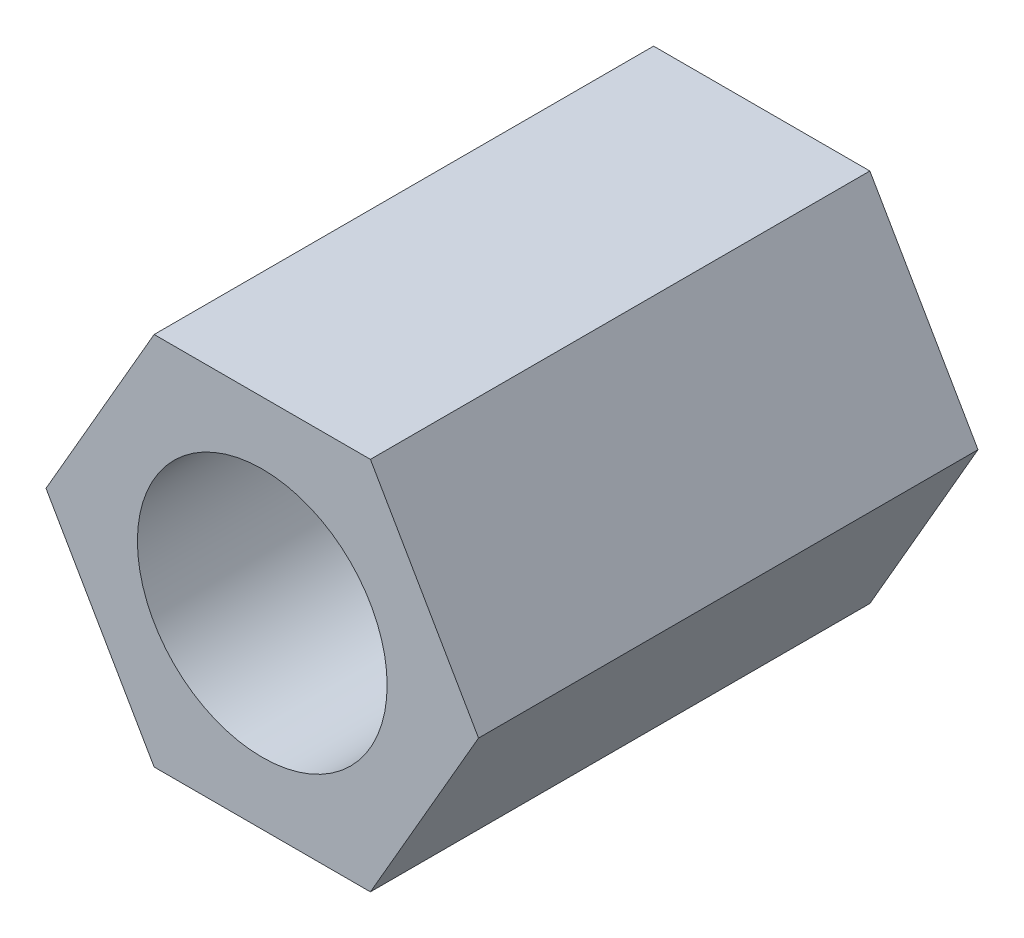
ISO-10303-21;
HEADER;
FILE_DESCRIPTION(('STEP AP214'),'2;1');
FILE_NAME('part.step','',(''),(''),'','','');
FILE_SCHEMA(('AUTOMOTIVE_DESIGN { 1 0 10303 214 1 1 1 1 }'));
ENDSEC;
DATA;
#1=APPLICATION_CONTEXT('core data for automotive mechanical design processes');
#2=APPLICATION_PROTOCOL_DEFINITION('international standard','automotive_design',2000,#1);
#3=PRODUCT_CONTEXT('',#1,'mechanical');
#4=PRODUCT('Part','Part','',(#3));
#5=PRODUCT_RELATED_PRODUCT_CATEGORY('part','',(#4));
#6=PRODUCT_DEFINITION_FORMATION('','',#4);
#7=PRODUCT_DEFINITION_CONTEXT('part definition',#1,'design');
#8=PRODUCT_DEFINITION('design','',#6,#7);
#9=PRODUCT_DEFINITION_SHAPE('','',#8);
#10=(LENGTH_UNIT() NAMED_UNIT(*) SI_UNIT(.MILLI.,.METRE.));
#11=(NAMED_UNIT(*) PLANE_ANGLE_UNIT() SI_UNIT($,.RADIAN.));
#12=(NAMED_UNIT(*) SI_UNIT($,.STERADIAN.) SOLID_ANGLE_UNIT());
#13=UNCERTAINTY_MEASURE_WITH_UNIT(LENGTH_MEASURE(1.E-05),#10,'distance_accuracy_value','');
#14=(GEOMETRIC_REPRESENTATION_CONTEXT(3) GLOBAL_UNCERTAINTY_ASSIGNED_CONTEXT((#13)) GLOBAL_UNIT_ASSIGNED_CONTEXT((#10,
#11,#12)) REPRESENTATION_CONTEXT('',''));
#15=CARTESIAN_POINT('',(0.,0.,0.));
#16=DIRECTION('',(0.,0.,1.));
#17=DIRECTION('',(1.,0.,0.));
#18=AXIS2_PLACEMENT_3D('',#15,#16,#17);
#19=CARTESIAN_POINT('',(0.,0.,4.));
#20=DIRECTION('',(0.,0.,1.));
#21=DIRECTION('',(1.,0.,0.));
#22=AXIS2_PLACEMENT_3D('',#19,#20,#21);
#23=PLANE('',#22);
#24=DIRECTION('',(0.5,0.866025403784438,0.));
#25=VECTOR('',#24,1.);
#26=CARTESIAN_POINT('',(0.86602540378444,-1.5,4.));
#27=LINE('',#26,#25);
#28=CARTESIAN_POINT('',(0.86602540378444,-1.5,4.));
#29=VERTEX_POINT('',#28);
#30=CARTESIAN_POINT('',(1.73205080756888,0.,4.));
#31=VERTEX_POINT('',#30);
#32=EDGE_CURVE('E145',#29,#31,#27,.T.);
#33=ORIENTED_EDGE('',*,*,#32,.T.);
#34=DIRECTION('',(-0.5,0.866025403784438,0.));
#35=VECTOR('',#34,1.);
#36=CARTESIAN_POINT('',(1.73205080756888,0.,4.));
#37=LINE('',#36,#35);
#38=CARTESIAN_POINT('',(0.866025403784438,1.5,4.));
#39=VERTEX_POINT('',#38);
#40=EDGE_CURVE('E93',#31,#39,#37,.T.);
#41=ORIENTED_EDGE('',*,*,#40,.T.);
#42=DIRECTION('',(-1.,0.,0.));
#43=VECTOR('',#42,1.);
#44=CARTESIAN_POINT('',(0.866025403784438,1.5,4.));
#45=LINE('',#44,#43);
#46=CARTESIAN_POINT('',(-0.866025403784439,1.5,4.));
#47=VERTEX_POINT('',#46);
#48=EDGE_CURVE('E106',#39,#47,#45,.T.);
#49=ORIENTED_EDGE('',*,*,#48,.T.);
#50=DIRECTION('',(-0.5,-0.866025403784438,0.));
#51=VECTOR('',#50,1.);
#52=CARTESIAN_POINT('',(-0.866025403784439,1.5,4.));
#53=LINE('',#52,#51);
#54=CARTESIAN_POINT('',(-1.73205080756888,0.,4.));
#55=VERTEX_POINT('',#54);
#56=EDGE_CURVE('E100',#47,#55,#53,.T.);
#57=ORIENTED_EDGE('',*,*,#56,.T.);
#58=DIRECTION('',(0.5,-0.866025403784438,0.));
#59=VECTOR('',#58,1.);
#60=CARTESIAN_POINT('',(-1.73205080756888,0.,4.));
#61=LINE('',#60,#59);
#62=CARTESIAN_POINT('',(-0.866025403784439,-1.5,4.));
#63=VERTEX_POINT('',#62);
#64=EDGE_CURVE('E104',#55,#63,#61,.T.);
#65=ORIENTED_EDGE('',*,*,#64,.T.);
#66=DIRECTION('',(1.,0.,0.));
#67=VECTOR('',#66,1.);
#68=CARTESIAN_POINT('',(-0.866025403784439,-1.5,4.));
#69=LINE('',#68,#67);
#70=EDGE_CURVE('E56',#63,#29,#69,.T.);
#71=ORIENTED_EDGE('',*,*,#70,.T.);
#72=EDGE_LOOP('',(#33,#41,#49,#57,#65,#71));
#73=FACE_BOUND('',#72,.T.);
#74=CARTESIAN_POINT('',(0.,0.,4.));
#75=DIRECTION('',(0.,0.,1.));
#76=DIRECTION('',(1.,0.,0.));
#77=AXIS2_PLACEMENT_3D('',#74,#75,#76);
#78=CIRCLE('',#77,1.);
#79=CARTESIAN_POINT('',(1.,0.,4.));
#80=VERTEX_POINT('',#79);
#81=EDGE_CURVE('E133',#80,#80,#78,.T.);
#82=ORIENTED_EDGE('',*,*,#81,.F.);
#83=EDGE_LOOP('',(#82));
#84=FACE_BOUND('',#83,.T.);
#85=ADVANCED_FACE('F38',(#73,#84),#23,.T.);
#86=CARTESIAN_POINT('',(0.,0.,0.));
#87=DIRECTION('',(0.,0.,1.));
#88=DIRECTION('',(1.,0.,0.));
#89=AXIS2_PLACEMENT_3D('',#86,#87,#88);
#90=PLANE('',#89);
#91=DIRECTION('',(0.5,0.866025403784438,0.));
#92=VECTOR('',#91,1.);
#93=CARTESIAN_POINT('',(0.86602540378444,-1.5,0.));
#94=LINE('',#93,#92);
#95=CARTESIAN_POINT('',(0.86602540378444,-1.5,0.));
#96=VERTEX_POINT('',#95);
#97=CARTESIAN_POINT('',(1.73205080756888,0.,0.));
#98=VERTEX_POINT('',#97);
#99=EDGE_CURVE('E128',#96,#98,#94,.T.);
#100=ORIENTED_EDGE('',*,*,#99,.F.);
#101=DIRECTION('',(1.,0.,0.));
#102=VECTOR('',#101,1.);
#103=CARTESIAN_POINT('',(-0.866025403784439,-1.5,0.));
#104=LINE('',#103,#102);
#105=CARTESIAN_POINT('',(-0.866025403784439,-1.5,0.));
#106=VERTEX_POINT('',#105);
#107=EDGE_CURVE('E85',#106,#96,#104,.T.);
#108=ORIENTED_EDGE('',*,*,#107,.F.);
#109=DIRECTION('',(0.5,-0.866025403784438,0.));
#110=VECTOR('',#109,1.);
#111=CARTESIAN_POINT('',(-1.73205080756888,0.,0.));
#112=LINE('',#111,#110);
#113=CARTESIAN_POINT('',(-1.73205080756888,0.,0.));
#114=VERTEX_POINT('',#113);
#115=EDGE_CURVE('E79',#114,#106,#112,.T.);
#116=ORIENTED_EDGE('',*,*,#115,.F.);
#117=DIRECTION('',(-0.5,-0.866025403784438,0.));
#118=VECTOR('',#117,1.);
#119=CARTESIAN_POINT('',(-0.866025403784439,1.5,0.));
#120=LINE('',#119,#118);
#121=CARTESIAN_POINT('',(-0.866025403784439,1.5,0.));
#122=VERTEX_POINT('',#121);
#123=EDGE_CURVE('E115',#122,#114,#120,.T.);
#124=ORIENTED_EDGE('',*,*,#123,.F.);
#125=DIRECTION('',(-1.,0.,0.));
#126=VECTOR('',#125,1.);
#127=CARTESIAN_POINT('',(0.866025403784438,1.5,0.));
#128=LINE('',#127,#126);
#129=CARTESIAN_POINT('',(0.866025403784438,1.5,0.));
#130=VERTEX_POINT('',#129);
#131=EDGE_CURVE('E136',#130,#122,#128,.T.);
#132=ORIENTED_EDGE('',*,*,#131,.F.);
#133=DIRECTION('',(-0.5,0.866025403784438,0.));
#134=VECTOR('',#133,1.);
#135=CARTESIAN_POINT('',(1.73205080756888,0.,0.));
#136=LINE('',#135,#134);
#137=EDGE_CURVE('E132',#98,#130,#136,.T.);
#138=ORIENTED_EDGE('',*,*,#137,.F.);
#139=EDGE_LOOP('',(#100,#108,#116,#124,#132,#138));
#140=FACE_BOUND('',#139,.T.);
#141=CARTESIAN_POINT('',(0.,0.,0.));
#142=DIRECTION('',(0.,0.,1.));
#143=DIRECTION('',(1.,0.,0.));
#144=AXIS2_PLACEMENT_3D('',#141,#142,#143);
#145=CIRCLE('',#144,1.);
#146=CARTESIAN_POINT('',(1.,0.,0.));
#147=VERTEX_POINT('',#146);
#148=EDGE_CURVE('E242',#147,#147,#145,.T.);
#149=ORIENTED_EDGE('',*,*,#148,.T.);
#150=EDGE_LOOP('',(#149));
#151=FACE_BOUND('',#150,.T.);
#152=ADVANCED_FACE('F158',(#140,#151),#90,.F.);
#153=CARTESIAN_POINT('',(0.86602540378444,-1.5,4.));
#154=DIRECTION('',(-0.866025403784439,0.5,0.));
#155=DIRECTION('',(-0.5,-0.866025403784438,0.));
#156=AXIS2_PLACEMENT_3D('',#153,#154,#155);
#157=PLANE('',#156);
#158=ORIENTED_EDGE('',*,*,#99,.T.);
#159=DIRECTION('',(0.,0.,-1.));
#160=VECTOR('',#159,1.);
#161=CARTESIAN_POINT('',(1.73205080756888,0.,4.));
#162=LINE('',#161,#160);
#163=EDGE_CURVE('E11',#31,#98,#162,.T.);
#164=ORIENTED_EDGE('',*,*,#163,.F.);
#165=ORIENTED_EDGE('',*,*,#32,.F.);
#166=DIRECTION('',(0.,0.,-1.));
#167=VECTOR('',#166,1.);
#168=CARTESIAN_POINT('',(0.86602540378444,-1.5,4.));
#169=LINE('',#168,#167);
#170=EDGE_CURVE('E124',#29,#96,#169,.T.);
#171=ORIENTED_EDGE('',*,*,#170,.T.);
#172=EDGE_LOOP('',(#158,#164,#165,#171));
#173=FACE_BOUND('',#172,.T.);
#174=ADVANCED_FACE('F40',(#173),#157,.F.);
#175=CARTESIAN_POINT('',(1.73205080756888,0.,4.));
#176=DIRECTION('',(-0.866025403784438,-0.5,0.));
#177=DIRECTION('',(0.5,-0.866025403784438,0.));
#178=AXIS2_PLACEMENT_3D('',#175,#176,#177);
#179=PLANE('',#178);
#180=ORIENTED_EDGE('',*,*,#137,.T.);
#181=DIRECTION('',(0.,0.,-1.));
#182=VECTOR('',#181,1.);
#183=CARTESIAN_POINT('',(0.866025403784438,1.5,4.));
#184=LINE('',#183,#182);
#185=EDGE_CURVE('E48',#39,#130,#184,.T.);
#186=ORIENTED_EDGE('',*,*,#185,.F.);
#187=ORIENTED_EDGE('',*,*,#40,.F.);
#188=ORIENTED_EDGE('',*,*,#163,.T.);
#189=EDGE_LOOP('',(#180,#186,#187,#188));
#190=FACE_BOUND('',#189,.T.);
#191=ADVANCED_FACE('F183',(#190),#179,.F.);
#192=CARTESIAN_POINT('',(0.866025403784438,1.5,4.));
#193=DIRECTION('',(0.,-1.,0.));
#194=DIRECTION('',(1.,0.,0.));
#195=AXIS2_PLACEMENT_3D('',#192,#193,#194);
#196=PLANE('',#195);
#197=ORIENTED_EDGE('',*,*,#131,.T.);
#198=DIRECTION('',(0.,0.,-1.));
#199=VECTOR('',#198,1.);
#200=CARTESIAN_POINT('',(-0.866025403784439,1.5,4.));
#201=LINE('',#200,#199);
#202=EDGE_CURVE('E117',#47,#122,#201,.T.);
#203=ORIENTED_EDGE('',*,*,#202,.F.);
#204=ORIENTED_EDGE('',*,*,#48,.F.);
#205=ORIENTED_EDGE('',*,*,#185,.T.);
#206=EDGE_LOOP('',(#197,#203,#204,#205));
#207=FACE_BOUND('',#206,.T.);
#208=ADVANCED_FACE('F155',(#207),#196,.F.);
#209=CARTESIAN_POINT('',(-0.866025403784439,1.5,4.));
#210=DIRECTION('',(0.866025403784439,-0.5,0.));
#211=DIRECTION('',(0.5,0.866025403784438,0.));
#212=AXIS2_PLACEMENT_3D('',#209,#210,#211);
#213=PLANE('',#212);
#214=ORIENTED_EDGE('',*,*,#123,.T.);
#215=DIRECTION('',(0.,0.,-1.));
#216=VECTOR('',#215,1.);
#217=CARTESIAN_POINT('',(-1.73205080756888,0.,4.));
#218=LINE('',#217,#216);
#219=EDGE_CURVE('E112',#55,#114,#218,.T.);
#220=ORIENTED_EDGE('',*,*,#219,.F.);
#221=ORIENTED_EDGE('',*,*,#56,.F.);
#222=ORIENTED_EDGE('',*,*,#202,.T.);
#223=EDGE_LOOP('',(#214,#220,#221,#222));
#224=FACE_BOUND('',#223,.T.);
#225=ADVANCED_FACE('F113',(#224),#213,.F.);
#226=CARTESIAN_POINT('',(-1.73205080756888,0.,4.));
#227=DIRECTION('',(0.866025403784438,0.5,0.));
#228=DIRECTION('',(-0.5,0.866025403784438,0.));
#229=AXIS2_PLACEMENT_3D('',#226,#227,#228);
#230=PLANE('',#229);
#231=ORIENTED_EDGE('',*,*,#115,.T.);
#232=DIRECTION('',(0.,0.,-1.));
#233=VECTOR('',#232,1.);
#234=CARTESIAN_POINT('',(-0.866025403784439,-1.5,4.));
#235=LINE('',#234,#233);
#236=EDGE_CURVE('E118',#63,#106,#235,.T.);
#237=ORIENTED_EDGE('',*,*,#236,.F.);
#238=ORIENTED_EDGE('',*,*,#64,.F.);
#239=ORIENTED_EDGE('',*,*,#219,.T.);
#240=EDGE_LOOP('',(#231,#237,#238,#239));
#241=FACE_BOUND('',#240,.T.);
#242=ADVANCED_FACE('F120',(#241),#230,.F.);
#243=CARTESIAN_POINT('',(-0.866025403784439,-1.5,4.));
#244=DIRECTION('',(0.,1.,0.));
#245=DIRECTION('',(-1.,0.,0.));
#246=AXIS2_PLACEMENT_3D('',#243,#244,#245);
#247=PLANE('',#246);
#248=ORIENTED_EDGE('',*,*,#107,.T.);
#249=ORIENTED_EDGE('',*,*,#170,.F.);
#250=ORIENTED_EDGE('',*,*,#70,.F.);
#251=ORIENTED_EDGE('',*,*,#236,.T.);
#252=EDGE_LOOP('',(#248,#249,#250,#251));
#253=FACE_BOUND('',#252,.T.);
#254=ADVANCED_FACE('F163',(#253),#247,.F.);
#255=CARTESIAN_POINT('',(0.,0.,4.));
#256=DIRECTION('',(0.,0.,-1.));
#257=DIRECTION('',(-1.,0.,0.));
#258=AXIS2_PLACEMENT_3D('',#255,#256,#257);
#259=CYLINDRICAL_SURFACE('',#258,1.);
#260=ORIENTED_EDGE('',*,*,#81,.T.);
#261=EDGE_LOOP('',(#260));
#262=FACE_BOUND('',#261,.T.);
#263=ORIENTED_EDGE('',*,*,#148,.F.);
#264=EDGE_LOOP('',(#263));
#265=FACE_BOUND('',#264,.T.);
#266=ADVANCED_FACE('F165',(#262,#265),#259,.F.);
#267=CLOSED_SHELL('',(#85,#152,#174,#191,#208,#225,#242,#254,#266));
#268=MANIFOLD_SOLID_BREP('B2',#267);
#269=ADVANCED_BREP_SHAPE_REPRESENTATION('',(#18,#268),#14);
#270=SHAPE_DEFINITION_REPRESENTATION(#9,#269);
ENDSEC;
END-ISO-10303-21;
